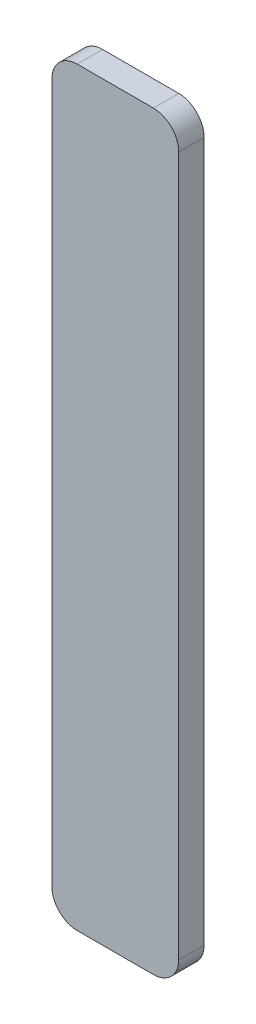
ISO-10303-21;
HEADER;
FILE_DESCRIPTION(('STEP AP214'),'2;1');
FILE_NAME('part.step','',(''),(''),'','','');
FILE_SCHEMA(('AUTOMOTIVE_DESIGN { 1 0 10303 214 1 1 1 1 }'));
ENDSEC;
DATA;
#1=APPLICATION_CONTEXT('core data for automotive mechanical design processes');
#2=APPLICATION_PROTOCOL_DEFINITION('international standard','automotive_design',2000,#1);
#3=PRODUCT_CONTEXT('',#1,'mechanical');
#4=PRODUCT('Part','Part','',(#3));
#5=PRODUCT_RELATED_PRODUCT_CATEGORY('part','',(#4));
#6=PRODUCT_DEFINITION_FORMATION('','',#4);
#7=PRODUCT_DEFINITION_CONTEXT('part definition',#1,'design');
#8=PRODUCT_DEFINITION('design','',#6,#7);
#9=PRODUCT_DEFINITION_SHAPE('','',#8);
#10=(LENGTH_UNIT() NAMED_UNIT(*) SI_UNIT(.MILLI.,.METRE.));
#11=(NAMED_UNIT(*) PLANE_ANGLE_UNIT() SI_UNIT($,.RADIAN.));
#12=(NAMED_UNIT(*) SI_UNIT($,.STERADIAN.) SOLID_ANGLE_UNIT());
#13=UNCERTAINTY_MEASURE_WITH_UNIT(LENGTH_MEASURE(1.E-05),#10,'distance_accuracy_value','');
#14=(GEOMETRIC_REPRESENTATION_CONTEXT(3) GLOBAL_UNCERTAINTY_ASSIGNED_CONTEXT((#13)) GLOBAL_UNIT_ASSIGNED_CONTEXT((#10,
#11,#12)) REPRESENTATION_CONTEXT('',''));
#15=CARTESIAN_POINT('',(0.,0.,0.));
#16=DIRECTION('',(0.,0.,1.));
#17=DIRECTION('',(1.,0.,0.));
#18=AXIS2_PLACEMENT_3D('',#15,#16,#17);
#19=CARTESIAN_POINT('',(-1.5,28.58,1.));
#20=DIRECTION('',(0.,0.,-1.));
#21=DIRECTION('',(-1.,0.,0.));
#22=AXIS2_PLACEMENT_3D('',#19,#20,#21);
#23=CYLINDRICAL_SURFACE('',#22,1.);
#24=CARTESIAN_POINT('',(-1.5,28.58,0.));
#25=DIRECTION('',(0.,0.,1.));
#26=DIRECTION('',(-1.,0.,0.));
#27=AXIS2_PLACEMENT_3D('',#24,#25,#26);
#28=CIRCLE('',#27,1.);
#29=CARTESIAN_POINT('',(-1.5,29.58,0.));
#30=VERTEX_POINT('',#29);
#31=CARTESIAN_POINT('',(-2.5,28.58,0.));
#32=VERTEX_POINT('',#31);
#33=EDGE_CURVE('E134',#30,#32,#28,.T.);
#34=ORIENTED_EDGE('',*,*,#33,.T.);
#35=DIRECTION('',(0.,0.,-1.));
#36=VECTOR('',#35,1.);
#37=CARTESIAN_POINT('',(-2.5,28.58,1.));
#38=LINE('',#37,#36);
#39=CARTESIAN_POINT('',(-2.5,28.58,1.));
#40=VERTEX_POINT('',#39);
#41=EDGE_CURVE('E11',#40,#32,#38,.T.);
#42=ORIENTED_EDGE('',*,*,#41,.F.);
#43=CARTESIAN_POINT('',(-1.5,28.58,1.));
#44=DIRECTION('',(0.,0.,1.));
#45=DIRECTION('',(-1.,0.,0.));
#46=AXIS2_PLACEMENT_3D('',#43,#44,#45);
#47=CIRCLE('',#46,1.);
#48=CARTESIAN_POINT('',(-1.5,29.58,1.));
#49=VERTEX_POINT('',#48);
#50=EDGE_CURVE('E148',#49,#40,#47,.T.);
#51=ORIENTED_EDGE('',*,*,#50,.F.);
#52=DIRECTION('',(0.,0.,-1.));
#53=VECTOR('',#52,1.);
#54=CARTESIAN_POINT('',(-1.5,29.58,1.));
#55=LINE('',#54,#53);
#56=EDGE_CURVE('E130',#49,#30,#55,.T.);
#57=ORIENTED_EDGE('',*,*,#56,.T.);
#58=EDGE_LOOP('',(#34,#42,#51,#57));
#59=FACE_BOUND('',#58,.T.);
#60=ADVANCED_FACE('F38',(#59),#23,.T.);
#61=CARTESIAN_POINT('',(-2.5,28.58,1.));
#62=DIRECTION('',(1.,0.,0.));
#63=DIRECTION('',(0.,1.,0.));
#64=AXIS2_PLACEMENT_3D('',#61,#62,#63);
#65=PLANE('',#64);
#66=DIRECTION('',(0.,-1.,0.));
#67=VECTOR('',#66,1.);
#68=CARTESIAN_POINT('',(-2.5,28.58,0.));
#69=LINE('',#68,#67);
#70=CARTESIAN_POINT('',(-2.5,1.,0.));
#71=VERTEX_POINT('',#70);
#72=EDGE_CURVE('E137',#32,#71,#69,.T.);
#73=ORIENTED_EDGE('',*,*,#72,.T.);
#74=DIRECTION('',(0.,0.,-1.));
#75=VECTOR('',#74,1.);
#76=CARTESIAN_POINT('',(-2.5,1.,1.));
#77=LINE('',#76,#75);
#78=CARTESIAN_POINT('',(-2.5,1.,1.));
#79=VERTEX_POINT('',#78);
#80=EDGE_CURVE('E46',#79,#71,#77,.T.);
#81=ORIENTED_EDGE('',*,*,#80,.F.);
#82=DIRECTION('',(0.,-1.,0.));
#83=VECTOR('',#82,1.);
#84=CARTESIAN_POINT('',(-2.5,28.58,1.));
#85=LINE('',#84,#83);
#86=EDGE_CURVE('E97',#40,#79,#85,.T.);
#87=ORIENTED_EDGE('',*,*,#86,.F.);
#88=ORIENTED_EDGE('',*,*,#41,.T.);
#89=EDGE_LOOP('',(#73,#81,#87,#88));
#90=FACE_BOUND('',#89,.T.);
#91=ADVANCED_FACE('F183',(#90),#65,.F.);
#92=CARTESIAN_POINT('',(-1.5,1.,1.));
#93=DIRECTION('',(0.,0.,-1.));
#94=DIRECTION('',(-1.,0.,0.));
#95=AXIS2_PLACEMENT_3D('',#92,#93,#94);
#96=CYLINDRICAL_SURFACE('',#95,1.);
#97=CARTESIAN_POINT('',(-1.5,1.,0.));
#98=DIRECTION('',(0.,0.,1.));
#99=DIRECTION('',(1.,0.,0.));
#100=AXIS2_PLACEMENT_3D('',#97,#98,#99);
#101=CIRCLE('',#100,1.);
#102=CARTESIAN_POINT('',(-1.5,0.,0.));
#103=VERTEX_POINT('',#102);
#104=EDGE_CURVE('E139',#71,#103,#101,.T.);
#105=ORIENTED_EDGE('',*,*,#104,.T.);
#106=DIRECTION('',(0.,0.,-1.));
#107=VECTOR('',#106,1.);
#108=CARTESIAN_POINT('',(-1.5,0.,1.));
#109=LINE('',#108,#107);
#110=CARTESIAN_POINT('',(-1.5,0.,1.));
#111=VERTEX_POINT('',#110);
#112=EDGE_CURVE('E155',#111,#103,#109,.T.);
#113=ORIENTED_EDGE('',*,*,#112,.F.);
#114=CARTESIAN_POINT('',(-1.5,1.,1.));
#115=DIRECTION('',(0.,0.,1.));
#116=DIRECTION('',(1.,0.,0.));
#117=AXIS2_PLACEMENT_3D('',#114,#115,#116);
#118=CIRCLE('',#117,1.);
#119=EDGE_CURVE('E163',#79,#111,#118,.T.);
#120=ORIENTED_EDGE('',*,*,#119,.F.);
#121=ORIENTED_EDGE('',*,*,#80,.T.);
#122=EDGE_LOOP('',(#105,#113,#120,#121));
#123=FACE_BOUND('',#122,.T.);
#124=ADVANCED_FACE('F161',(#123),#96,.T.);
#125=CARTESIAN_POINT('',(-1.5,0.,1.));
#126=DIRECTION('',(0.,1.,0.));
#127=DIRECTION('',(0.,0.,1.));
#128=AXIS2_PLACEMENT_3D('',#125,#126,#127);
#129=PLANE('',#128);
#130=DIRECTION('',(1.,0.,0.));
#131=VECTOR('',#130,1.);
#132=CARTESIAN_POINT('',(-1.5,0.,0.));
#133=LINE('',#132,#131);
#134=CARTESIAN_POINT('',(1.5,0.,0.));
#135=VERTEX_POINT('',#134);
#136=EDGE_CURVE('E141',#103,#135,#133,.T.);
#137=ORIENTED_EDGE('',*,*,#136,.T.);
#138=DIRECTION('',(0.,0.,-1.));
#139=VECTOR('',#138,1.);
#140=CARTESIAN_POINT('',(1.5,0.,1.));
#141=LINE('',#140,#139);
#142=CARTESIAN_POINT('',(1.5,0.,1.));
#143=VERTEX_POINT('',#142);
#144=EDGE_CURVE('E152',#143,#135,#141,.T.);
#145=ORIENTED_EDGE('',*,*,#144,.F.);
#146=DIRECTION('',(1.,0.,0.));
#147=VECTOR('',#146,1.);
#148=CARTESIAN_POINT('',(-1.5,0.,1.));
#149=LINE('',#148,#147);
#150=EDGE_CURVE('E175',#111,#143,#149,.T.);
#151=ORIENTED_EDGE('',*,*,#150,.F.);
#152=ORIENTED_EDGE('',*,*,#112,.T.);
#153=EDGE_LOOP('',(#137,#145,#151,#152));
#154=FACE_BOUND('',#153,.T.);
#155=ADVANCED_FACE('F171',(#154),#129,.F.);
#156=CARTESIAN_POINT('',(1.5,1.,1.));
#157=DIRECTION('',(0.,0.,-1.));
#158=DIRECTION('',(-1.,0.,0.));
#159=AXIS2_PLACEMENT_3D('',#156,#157,#158);
#160=CYLINDRICAL_SURFACE('',#159,1.);
#161=CARTESIAN_POINT('',(1.5,1.,0.));
#162=DIRECTION('',(0.,0.,1.));
#163=DIRECTION('',(-1.,0.,0.));
#164=AXIS2_PLACEMENT_3D('',#161,#162,#163);
#165=CIRCLE('',#164,1.);
#166=CARTESIAN_POINT('',(2.5,1.,0.));
#167=VERTEX_POINT('',#166);
#168=EDGE_CURVE('E143',#135,#167,#165,.T.);
#169=ORIENTED_EDGE('',*,*,#168,.T.);
#170=DIRECTION('',(0.,0.,-1.));
#171=VECTOR('',#170,1.);
#172=CARTESIAN_POINT('',(2.5,1.,1.));
#173=LINE('',#172,#171);
#174=CARTESIAN_POINT('',(2.5,1.,1.));
#175=VERTEX_POINT('',#174);
#176=EDGE_CURVE('E125',#175,#167,#173,.T.);
#177=ORIENTED_EDGE('',*,*,#176,.F.);
#178=CARTESIAN_POINT('',(1.5,1.,1.));
#179=DIRECTION('',(0.,0.,1.));
#180=DIRECTION('',(-1.,0.,0.));
#181=AXIS2_PLACEMENT_3D('',#178,#179,#180);
#182=CIRCLE('',#181,1.);
#183=EDGE_CURVE('E116',#143,#175,#182,.T.);
#184=ORIENTED_EDGE('',*,*,#183,.F.);
#185=ORIENTED_EDGE('',*,*,#144,.T.);
#186=EDGE_LOOP('',(#169,#177,#184,#185));
#187=FACE_BOUND('',#186,.T.);
#188=ADVANCED_FACE('F174',(#187),#160,.T.);
#189=CARTESIAN_POINT('',(2.5,28.58,1.));
#190=DIRECTION('',(-1.,0.,0.));
#191=DIRECTION('',(0.,-1.,0.));
#192=AXIS2_PLACEMENT_3D('',#189,#190,#191);
#193=PLANE('',#192);
#194=DIRECTION('',(0.,1.,0.));
#195=VECTOR('',#194,1.);
#196=CARTESIAN_POINT('',(2.5,28.58,0.));
#197=LINE('',#196,#195);
#198=CARTESIAN_POINT('',(2.5,28.58,0.));
#199=VERTEX_POINT('',#198);
#200=EDGE_CURVE('E124',#167,#199,#197,.T.);
#201=ORIENTED_EDGE('',*,*,#200,.T.);
#202=DIRECTION('',(0.,0.,-1.));
#203=VECTOR('',#202,1.);
#204=CARTESIAN_POINT('',(2.5,28.58,1.));
#205=LINE('',#204,#203);
#206=CARTESIAN_POINT('',(2.5,28.58,1.));
#207=VERTEX_POINT('',#206);
#208=EDGE_CURVE('E121',#207,#199,#205,.T.);
#209=ORIENTED_EDGE('',*,*,#208,.F.);
#210=DIRECTION('',(0.,1.,0.));
#211=VECTOR('',#210,1.);
#212=CARTESIAN_POINT('',(2.5,28.58,1.));
#213=LINE('',#212,#211);
#214=EDGE_CURVE('E110',#175,#207,#213,.T.);
#215=ORIENTED_EDGE('',*,*,#214,.F.);
#216=ORIENTED_EDGE('',*,*,#176,.T.);
#217=EDGE_LOOP('',(#201,#209,#215,#216));
#218=FACE_BOUND('',#217,.T.);
#219=ADVANCED_FACE('F122',(#218),#193,.F.);
#220=CARTESIAN_POINT('',(1.5,28.58,1.));
#221=DIRECTION('',(0.,0.,-1.));
#222=DIRECTION('',(-1.,0.,0.));
#223=AXIS2_PLACEMENT_3D('',#220,#221,#222);
#224=CYLINDRICAL_SURFACE('',#223,1.);
#225=CARTESIAN_POINT('',(1.5,28.58,0.));
#226=DIRECTION('',(0.,0.,1.));
#227=DIRECTION('',(1.,0.,0.));
#228=AXIS2_PLACEMENT_3D('',#225,#226,#227);
#229=CIRCLE('',#228,1.);
#230=CARTESIAN_POINT('',(1.5,29.58,0.));
#231=VERTEX_POINT('',#230);
#232=EDGE_CURVE('E83',#199,#231,#229,.T.);
#233=ORIENTED_EDGE('',*,*,#232,.T.);
#234=DIRECTION('',(0.,0.,-1.));
#235=VECTOR('',#234,1.);
#236=CARTESIAN_POINT('',(1.5,29.58,1.));
#237=LINE('',#236,#235);
#238=CARTESIAN_POINT('',(1.5,29.58,1.));
#239=VERTEX_POINT('',#238);
#240=EDGE_CURVE('E126',#239,#231,#237,.T.);
#241=ORIENTED_EDGE('',*,*,#240,.F.);
#242=CARTESIAN_POINT('',(1.5,28.58,1.));
#243=DIRECTION('',(0.,0.,1.));
#244=DIRECTION('',(1.,0.,0.));
#245=AXIS2_PLACEMENT_3D('',#242,#243,#244);
#246=CIRCLE('',#245,1.);
#247=EDGE_CURVE('E114',#207,#239,#246,.T.);
#248=ORIENTED_EDGE('',*,*,#247,.F.);
#249=ORIENTED_EDGE('',*,*,#208,.T.);
#250=EDGE_LOOP('',(#233,#241,#248,#249));
#251=FACE_BOUND('',#250,.T.);
#252=ADVANCED_FACE('F128',(#251),#224,.T.);
#253=CARTESIAN_POINT('',(-1.5,29.58,1.));
#254=DIRECTION('',(0.,-1.,0.));
#255=DIRECTION('',(0.,0.,-1.));
#256=AXIS2_PLACEMENT_3D('',#253,#254,#255);
#257=PLANE('',#256);
#258=DIRECTION('',(-1.,0.,0.));
#259=VECTOR('',#258,1.);
#260=CARTESIAN_POINT('',(-1.5,29.58,0.));
#261=LINE('',#260,#259);
#262=EDGE_CURVE('E89',#231,#30,#261,.T.);
#263=ORIENTED_EDGE('',*,*,#262,.T.);
#264=ORIENTED_EDGE('',*,*,#56,.F.);
#265=DIRECTION('',(-1.,0.,0.));
#266=VECTOR('',#265,1.);
#267=CARTESIAN_POINT('',(-1.5,29.58,1.));
#268=LINE('',#267,#266);
#269=EDGE_CURVE('E54',#239,#49,#268,.T.);
#270=ORIENTED_EDGE('',*,*,#269,.F.);
#271=ORIENTED_EDGE('',*,*,#240,.T.);
#272=EDGE_LOOP('',(#263,#264,#270,#271));
#273=FACE_BOUND('',#272,.T.);
#274=ADVANCED_FACE('F199',(#273),#257,.F.);
#275=CARTESIAN_POINT('',(-1.5,28.58,1.));
#276=DIRECTION('',(0.,0.,-1.));
#277=DIRECTION('',(-1.,0.,0.));
#278=AXIS2_PLACEMENT_3D('',#275,#276,#277);
#279=PLANE('',#278);
#280=ORIENTED_EDGE('',*,*,#50,.T.);
#281=ORIENTED_EDGE('',*,*,#86,.T.);
#282=ORIENTED_EDGE('',*,*,#119,.T.);
#283=ORIENTED_EDGE('',*,*,#150,.T.);
#284=ORIENTED_EDGE('',*,*,#183,.T.);
#285=ORIENTED_EDGE('',*,*,#214,.T.);
#286=ORIENTED_EDGE('',*,*,#247,.T.);
#287=ORIENTED_EDGE('',*,*,#269,.T.);
#288=EDGE_LOOP('',(#280,#281,#282,#283,#284,#285,#286,#287));
#289=FACE_BOUND('',#288,.T.);
#290=ADVANCED_FACE('F112',(#289),#279,.F.);
#291=CARTESIAN_POINT('',(-1.5,28.58,0.));
#292=DIRECTION('',(0.,0.,-1.));
#293=DIRECTION('',(-1.,0.,0.));
#294=AXIS2_PLACEMENT_3D('',#291,#292,#293);
#295=PLANE('',#294);
#296=ORIENTED_EDGE('',*,*,#33,.F.);
#297=ORIENTED_EDGE('',*,*,#262,.F.);
#298=ORIENTED_EDGE('',*,*,#232,.F.);
#299=ORIENTED_EDGE('',*,*,#200,.F.);
#300=ORIENTED_EDGE('',*,*,#168,.F.);
#301=ORIENTED_EDGE('',*,*,#136,.F.);
#302=ORIENTED_EDGE('',*,*,#104,.F.);
#303=ORIENTED_EDGE('',*,*,#72,.F.);
#304=EDGE_LOOP('',(#296,#297,#298,#299,#300,#301,#302,#303));
#305=FACE_BOUND('',#304,.T.);
#306=ADVANCED_FACE('F167',(#305),#295,.T.);
#307=CLOSED_SHELL('',(#60,#91,#124,#155,#188,#219,#252,#274,#290,#306));
#308=MANIFOLD_SOLID_BREP('B2',#307);
#309=ADVANCED_BREP_SHAPE_REPRESENTATION('',(#18,#308),#14);
#310=SHAPE_DEFINITION_REPRESENTATION(#9,#309);
ENDSEC;
END-ISO-10303-21;
